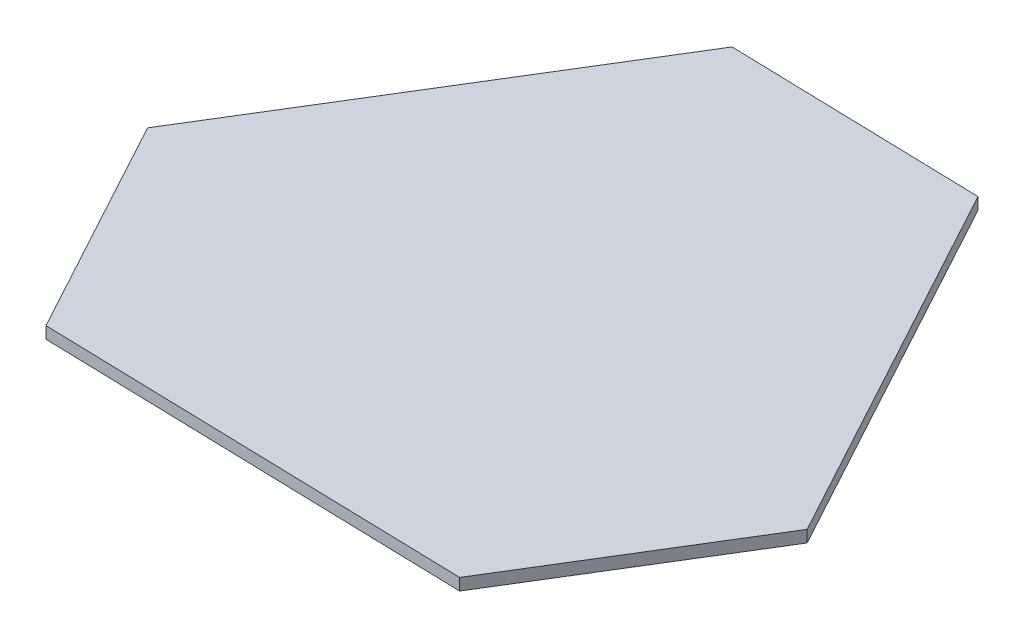
ISO-10303-21;
HEADER;
FILE_DESCRIPTION(('STEP AP214'),'2;1');
FILE_NAME('part.step','',(''),(''),'','','');
FILE_SCHEMA(('AUTOMOTIVE_DESIGN { 1 0 10303 214 1 1 1 1 }'));
ENDSEC;
DATA;
#1=APPLICATION_CONTEXT('core data for automotive mechanical design processes');
#2=APPLICATION_PROTOCOL_DEFINITION('international standard','automotive_design',2000,#1);
#3=PRODUCT_CONTEXT('',#1,'mechanical');
#4=PRODUCT('Part','Part','',(#3));
#5=PRODUCT_RELATED_PRODUCT_CATEGORY('part','',(#4));
#6=PRODUCT_DEFINITION_FORMATION('','',#4);
#7=PRODUCT_DEFINITION_CONTEXT('part definition',#1,'design');
#8=PRODUCT_DEFINITION('design','',#6,#7);
#9=PRODUCT_DEFINITION_SHAPE('','',#8);
#10=(LENGTH_UNIT() NAMED_UNIT(*) SI_UNIT(.MILLI.,.METRE.));
#11=(NAMED_UNIT(*) PLANE_ANGLE_UNIT() SI_UNIT($,.RADIAN.));
#12=(NAMED_UNIT(*) SI_UNIT($,.STERADIAN.) SOLID_ANGLE_UNIT());
#13=UNCERTAINTY_MEASURE_WITH_UNIT(LENGTH_MEASURE(1.E-05),#10,'distance_accuracy_value','');
#14=(GEOMETRIC_REPRESENTATION_CONTEXT(3) GLOBAL_UNCERTAINTY_ASSIGNED_CONTEXT((#13)) GLOBAL_UNIT_ASSIGNED_CONTEXT((#10,
#11,#12)) REPRESENTATION_CONTEXT('',''));
#15=CARTESIAN_POINT('',(0.,0.,0.));
#16=DIRECTION('',(0.,0.,1.));
#17=DIRECTION('',(1.,0.,0.));
#18=AXIS2_PLACEMENT_3D('',#15,#16,#17);
#19=CARTESIAN_POINT('',(134.129910972901,5.,36.5832200702413));
#20=DIRECTION('',(-0.878956376001227,0.,0.476902179788256));
#21=DIRECTION('',(0.476902179788256,0.,0.878956376001227));
#22=AXIS2_PLACEMENT_3D('',#19,#20,#21);
#23=PLANE('',#22);
#24=DIRECTION('',(-0.476902179788256,0.,-0.878956376001226));
#25=VECTOR('',#24,1.);
#26=CARTESIAN_POINT('',(134.129910972901,0.,36.5832200702413));
#27=LINE('',#26,#25);
#28=CARTESIAN_POINT('',(134.129910972901,0.,36.5832200702413));
#29=VERTEX_POINT('',#28);
#30=CARTESIAN_POINT('',(48.2875186110151,0.,-121.628927609979));
#31=VERTEX_POINT('',#30);
#32=EDGE_CURVE('E119',#29,#31,#27,.T.);
#33=ORIENTED_EDGE('',*,*,#32,.T.);
#34=DIRECTION('',(0.,-1.,0.));
#35=VECTOR('',#34,1.);
#36=CARTESIAN_POINT('',(48.2875186110151,5.,-121.628927609979));
#37=LINE('',#36,#35);
#38=CARTESIAN_POINT('',(48.2875186110151,5.,-121.628927609979));
#39=VERTEX_POINT('',#38);
#40=EDGE_CURVE('E11',#39,#31,#37,.T.);
#41=ORIENTED_EDGE('',*,*,#40,.F.);
#42=DIRECTION('',(-0.476902179788256,0.,-0.878956376001226));
#43=VECTOR('',#42,1.);
#44=CARTESIAN_POINT('',(134.129910972901,5.,36.5832200702413));
#45=LINE('',#44,#43);
#46=CARTESIAN_POINT('',(134.129910972901,5.,36.5832200702413));
#47=VERTEX_POINT('',#46);
#48=EDGE_CURVE('E129',#47,#39,#45,.T.);
#49=ORIENTED_EDGE('',*,*,#48,.F.);
#50=DIRECTION('',(0.,-1.,0.));
#51=VECTOR('',#50,1.);
#52=CARTESIAN_POINT('',(134.129910972901,5.,36.5832200702413));
#53=LINE('',#52,#51);
#54=EDGE_CURVE('E115',#47,#29,#53,.T.);
#55=ORIENTED_EDGE('',*,*,#54,.T.);
#56=EDGE_LOOP('',(#33,#41,#49,#55));
#57=FACE_BOUND('',#56,.T.);
#58=ADVANCED_FACE('F35',(#57),#23,.F.);
#59=CARTESIAN_POINT('',(48.2875186110151,5.,-121.628927609979));
#60=DIRECTION('',(-0.0264687851838095,0.,0.999649640329497));
#61=DIRECTION('',(0.999649640329497,0.,0.0264687851838095));
#62=AXIS2_PLACEMENT_3D('',#59,#60,#61);
#63=PLANE('',#62);
#64=DIRECTION('',(-0.999649640329497,0.,-0.0264687851838095));
#65=VECTOR('',#64,1.);
#66=CARTESIAN_POINT('',(48.2875186110151,0.,-121.628927609979));
#67=LINE('',#66,#65);
#68=CARTESIAN_POINT('',(-58.6749929042411,0.,-124.461087624647));
#69=VERTEX_POINT('',#68);
#70=EDGE_CURVE('E122',#31,#69,#67,.T.);
#71=ORIENTED_EDGE('',*,*,#70,.T.);
#72=DIRECTION('',(0.,-1.,0.));
#73=VECTOR('',#72,1.);
#74=CARTESIAN_POINT('',(-58.6749929042411,5.,-124.461087624647));
#75=LINE('',#74,#73);
#76=CARTESIAN_POINT('',(-58.6749929042411,5.,-124.461087624647));
#77=VERTEX_POINT('',#76);
#78=EDGE_CURVE('E43',#77,#69,#75,.T.);
#79=ORIENTED_EDGE('',*,*,#78,.F.);
#80=DIRECTION('',(-0.999649640329497,0.,-0.0264687851838095));
#81=VECTOR('',#80,1.);
#82=CARTESIAN_POINT('',(48.2875186110151,5.,-121.628927609979));
#83=LINE('',#82,#81);
#84=EDGE_CURVE('E88',#39,#77,#83,.T.);
#85=ORIENTED_EDGE('',*,*,#84,.F.);
#86=ORIENTED_EDGE('',*,*,#40,.T.);
#87=EDGE_LOOP('',(#71,#79,#85,#86));
#88=FACE_BOUND('',#87,.T.);
#89=ADVANCED_FACE('F153',(#88),#63,.F.);
#90=CARTESIAN_POINT('',(-58.6749929042411,5.,-124.461087624647));
#91=DIRECTION('',(0.852487590817417,0.,0.522747460541241));
#92=DIRECTION('',(0.522747460541241,0.,-0.852487590817417));
#93=AXIS2_PLACEMENT_3D('',#90,#91,#92);
#94=PLANE('',#93);
#95=DIRECTION('',(-0.522747460541241,0.,0.852487590817417));
#96=VECTOR('',#95,1.);
#97=CARTESIAN_POINT('',(-58.6749929042411,0.,-124.461087624647));
#98=LINE('',#97,#96);
#99=CARTESIAN_POINT('',(-152.769535801664,0.,28.986678722488));
#100=VERTEX_POINT('',#99);
#101=EDGE_CURVE('E124',#69,#100,#98,.T.);
#102=ORIENTED_EDGE('',*,*,#101,.T.);
#103=DIRECTION('',(0.,-1.,0.));
#104=VECTOR('',#103,1.);
#105=CARTESIAN_POINT('',(-152.769535801664,5.,28.986678722488));
#106=LINE('',#105,#104);
#107=CARTESIAN_POINT('',(-152.769535801664,5.,28.986678722488));
#108=VERTEX_POINT('',#107);
#109=EDGE_CURVE('E110',#108,#100,#106,.T.);
#110=ORIENTED_EDGE('',*,*,#109,.F.);
#111=DIRECTION('',(-0.522747460541241,0.,0.852487590817417));
#112=VECTOR('',#111,1.);
#113=CARTESIAN_POINT('',(-58.6749929042411,5.,-124.461087624647));
#114=LINE('',#113,#112);
#115=EDGE_CURVE('E101',#77,#108,#114,.T.);
#116=ORIENTED_EDGE('',*,*,#115,.F.);
#117=ORIENTED_EDGE('',*,*,#78,.T.);
#118=EDGE_LOOP('',(#102,#110,#116,#117));
#119=FACE_BOUND('',#118,.T.);
#120=ADVANCED_FACE('F135',(#119),#94,.F.);
#121=CARTESIAN_POINT('',(-152.769535801664,5.,28.986678722488));
#122=DIRECTION('',(0.878956376001227,0.,-0.476902179788256));
#123=DIRECTION('',(-0.476902179788256,0.,-0.878956376001227));
#124=AXIS2_PLACEMENT_3D('',#121,#122,#123);
#125=PLANE('',#124);
#126=DIRECTION('',(0.476902179788256,0.,0.878956376001227));
#127=VECTOR('',#126,1.);
#128=CARTESIAN_POINT('',(-152.769535801664,0.,28.986678722488));
#129=LINE('',#128,#127);
#130=CARTESIAN_POINT('',(-101.741002564321,0.,123.035010954619));
#131=VERTEX_POINT('',#130);
#132=EDGE_CURVE('E109',#100,#131,#129,.T.);
#133=ORIENTED_EDGE('',*,*,#132,.T.);
#134=DIRECTION('',(0.,-1.,0.));
#135=VECTOR('',#134,1.);
#136=CARTESIAN_POINT('',(-101.741002564321,5.,123.035010954619));
#137=LINE('',#136,#135);
#138=CARTESIAN_POINT('',(-101.741002564321,5.,123.035010954619));
#139=VERTEX_POINT('',#138);
#140=EDGE_CURVE('E106',#139,#131,#137,.T.);
#141=ORIENTED_EDGE('',*,*,#140,.F.);
#142=DIRECTION('',(0.476902179788256,0.,0.878956376001227));
#143=VECTOR('',#142,1.);
#144=CARTESIAN_POINT('',(-152.769535801664,5.,28.986678722488));
#145=LINE('',#144,#143);
#146=EDGE_CURVE('E95',#108,#139,#145,.T.);
#147=ORIENTED_EDGE('',*,*,#146,.F.);
#148=ORIENTED_EDGE('',*,*,#109,.T.);
#149=EDGE_LOOP('',(#133,#141,#147,#148));
#150=FACE_BOUND('',#149,.T.);
#151=ADVANCED_FACE('F107',(#150),#125,.F.);
#152=CARTESIAN_POINT('',(-101.741002564321,5.,123.035010954619));
#153=DIRECTION('',(0.0264687851838261,0.,-0.999649640329497));
#154=DIRECTION('',(-0.999649640329497,0.,-0.0264687851838261));
#155=AXIS2_PLACEMENT_3D('',#152,#153,#154);
#156=PLANE('',#155);
#157=DIRECTION('',(0.999649640329497,0.,0.0264687851838261));
#158=VECTOR('',#157,1.);
#159=CARTESIAN_POINT('',(-101.741002564321,0.,123.035010954619));
#160=LINE('',#159,#158);
#161=CARTESIAN_POINT('',(78.1959326949884,0.,127.799392287708));
#162=VERTEX_POINT('',#161);
#163=EDGE_CURVE('E74',#131,#162,#160,.T.);
#164=ORIENTED_EDGE('',*,*,#163,.T.);
#165=DIRECTION('',(0.,-1.,0.));
#166=VECTOR('',#165,1.);
#167=CARTESIAN_POINT('',(78.1959326949884,5.,127.799392287708));
#168=LINE('',#167,#166);
#169=CARTESIAN_POINT('',(78.1959326949884,5.,127.799392287708));
#170=VERTEX_POINT('',#169);
#171=EDGE_CURVE('E111',#170,#162,#168,.T.);
#172=ORIENTED_EDGE('',*,*,#171,.F.);
#173=DIRECTION('',(0.999649640329497,0.,0.0264687851838261));
#174=VECTOR('',#173,1.);
#175=CARTESIAN_POINT('',(-101.741002564321,5.,123.035010954619));
#176=LINE('',#175,#174);
#177=EDGE_CURVE('E99',#139,#170,#176,.T.);
#178=ORIENTED_EDGE('',*,*,#177,.F.);
#179=ORIENTED_EDGE('',*,*,#140,.T.);
#180=EDGE_LOOP('',(#164,#172,#178,#179));
#181=FACE_BOUND('',#180,.T.);
#182=ADVANCED_FACE('F113',(#181),#156,.F.);
#183=CARTESIAN_POINT('',(78.1959326949884,5.,127.799392287708));
#184=DIRECTION('',(-0.852487590817425,0.,-0.522747460541229));
#185=DIRECTION('',(-0.522747460541229,0.,0.852487590817425));
#186=AXIS2_PLACEMENT_3D('',#183,#184,#185);
#187=PLANE('',#186);
#188=DIRECTION('',(0.522747460541229,0.,-0.852487590817425));
#189=VECTOR('',#188,1.);
#190=CARTESIAN_POINT('',(78.1959326949884,0.,127.799392287708));
#191=LINE('',#190,#189);
#192=EDGE_CURVE('E80',#162,#29,#191,.T.);
#193=ORIENTED_EDGE('',*,*,#192,.T.);
#194=ORIENTED_EDGE('',*,*,#54,.F.);
#195=DIRECTION('',(0.522747460541229,0.,-0.852487590817425));
#196=VECTOR('',#195,1.);
#197=CARTESIAN_POINT('',(78.1959326949884,5.,127.799392287708));
#198=LINE('',#197,#196);
#199=EDGE_CURVE('E51',#170,#47,#198,.T.);
#200=ORIENTED_EDGE('',*,*,#199,.F.);
#201=ORIENTED_EDGE('',*,*,#171,.T.);
#202=EDGE_LOOP('',(#193,#194,#200,#201));
#203=FACE_BOUND('',#202,.T.);
#204=ADVANCED_FACE('F142',(#203),#187,.F.);
#205=CARTESIAN_POINT('',(0.,5.,0.));
#206=DIRECTION('',(0.,1.,0.));
#207=DIRECTION('',(0.,0.,1.));
#208=AXIS2_PLACEMENT_3D('',#205,#206,#207);
#209=PLANE('',#208);
#210=ORIENTED_EDGE('',*,*,#48,.T.);
#211=ORIENTED_EDGE('',*,*,#84,.T.);
#212=ORIENTED_EDGE('',*,*,#115,.T.);
#213=ORIENTED_EDGE('',*,*,#146,.T.);
#214=ORIENTED_EDGE('',*,*,#177,.T.);
#215=ORIENTED_EDGE('',*,*,#199,.T.);
#216=EDGE_LOOP('',(#210,#211,#212,#213,#214,#215));
#217=FACE_BOUND('',#216,.T.);
#218=ADVANCED_FACE('F97',(#217),#209,.T.);
#219=CARTESIAN_POINT('',(0.,0.,0.));
#220=DIRECTION('',(0.,1.,0.));
#221=DIRECTION('',(0.,0.,1.));
#222=AXIS2_PLACEMENT_3D('',#219,#220,#221);
#223=PLANE('',#222);
#224=ORIENTED_EDGE('',*,*,#32,.F.);
#225=ORIENTED_EDGE('',*,*,#192,.F.);
#226=ORIENTED_EDGE('',*,*,#163,.F.);
#227=ORIENTED_EDGE('',*,*,#132,.F.);
#228=ORIENTED_EDGE('',*,*,#101,.F.);
#229=ORIENTED_EDGE('',*,*,#70,.F.);
#230=EDGE_LOOP('',(#224,#225,#226,#227,#228,#229));
#231=FACE_BOUND('',#230,.T.);
#232=ADVANCED_FACE('F138',(#231),#223,.F.);
#233=CLOSED_SHELL('',(#58,#89,#120,#151,#182,#204,#218,#232));
#234=MANIFOLD_SOLID_BREP('B2',#233);
#235=ADVANCED_BREP_SHAPE_REPRESENTATION('',(#18,#234),#14);
#236=SHAPE_DEFINITION_REPRESENTATION(#9,#235);
ENDSEC;
END-ISO-10303-21;
